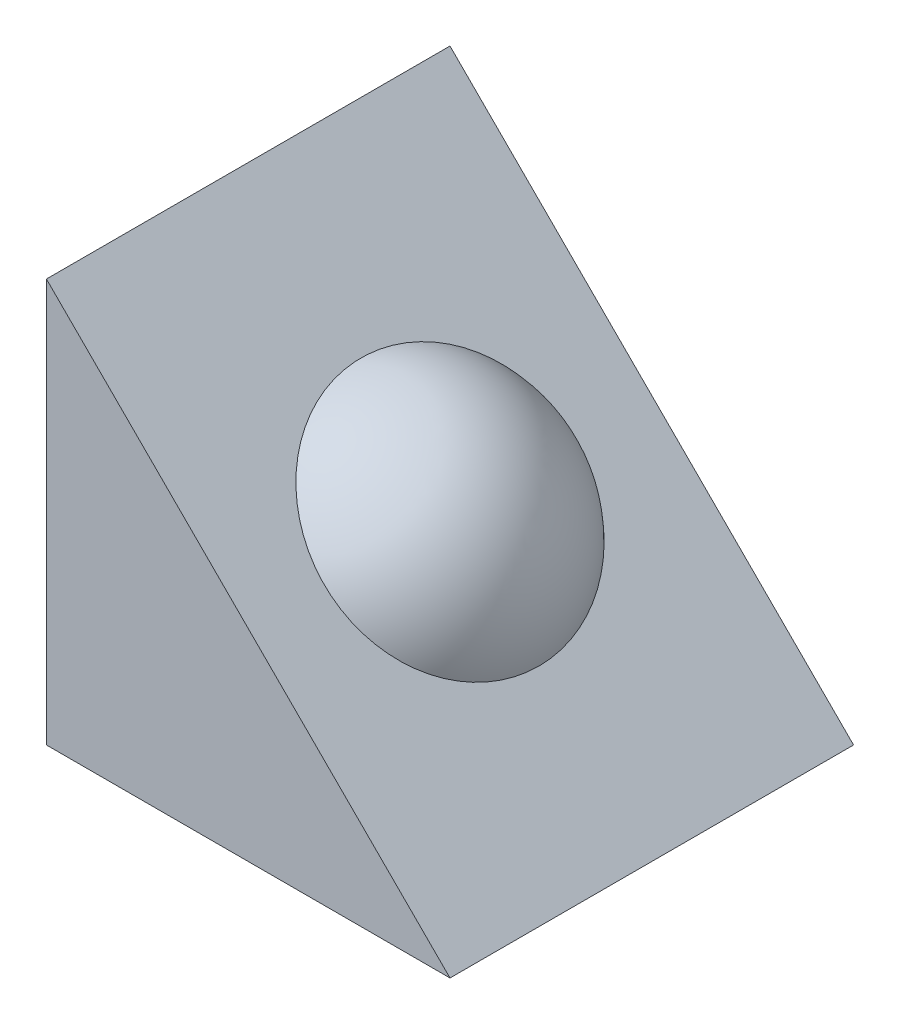
ISO-10303-21;
HEADER;
FILE_DESCRIPTION(('STEP AP214'),'2;1');
FILE_NAME('part.step','',(''),(''),'','','');
FILE_SCHEMA(('AUTOMOTIVE_DESIGN { 1 0 10303 214 1 1 1 1 }'));
ENDSEC;
DATA;
#1=APPLICATION_CONTEXT('core data for automotive mechanical design processes');
#2=APPLICATION_PROTOCOL_DEFINITION('international standard','automotive_design',2000,#1);
#3=PRODUCT_CONTEXT('',#1,'mechanical');
#4=PRODUCT('Part','Part','',(#3));
#5=PRODUCT_RELATED_PRODUCT_CATEGORY('part','',(#4));
#6=PRODUCT_DEFINITION_FORMATION('','',#4);
#7=PRODUCT_DEFINITION_CONTEXT('part definition',#1,'design');
#8=PRODUCT_DEFINITION('design','',#6,#7);
#9=PRODUCT_DEFINITION_SHAPE('','',#8);
#10=(LENGTH_UNIT() NAMED_UNIT(*) SI_UNIT(.MILLI.,.METRE.));
#11=(NAMED_UNIT(*) PLANE_ANGLE_UNIT() SI_UNIT($,.RADIAN.));
#12=(NAMED_UNIT(*) SI_UNIT($,.STERADIAN.) SOLID_ANGLE_UNIT());
#13=UNCERTAINTY_MEASURE_WITH_UNIT(LENGTH_MEASURE(1.E-05),#10,'distance_accuracy_value','');
#14=(GEOMETRIC_REPRESENTATION_CONTEXT(3) GLOBAL_UNCERTAINTY_ASSIGNED_CONTEXT((#13)) GLOBAL_UNIT_ASSIGNED_CONTEXT((#10,
#11,#12)) REPRESENTATION_CONTEXT('',''));
#15=CARTESIAN_POINT('',(0.,0.,0.));
#16=DIRECTION('',(0.,0.,1.));
#17=DIRECTION('',(1.,0.,0.));
#18=AXIS2_PLACEMENT_3D('',#15,#16,#17);
#19=CARTESIAN_POINT('',(0.,0.,25.));
#20=DIRECTION('',(0.,1.,0.));
#21=DIRECTION('',(0.,0.,1.));
#22=AXIS2_PLACEMENT_3D('',#19,#20,#21);
#23=PLANE('',#22);
#24=DIRECTION('',(1.,0.,0.));
#25=VECTOR('',#24,1.);
#26=CARTESIAN_POINT('',(0.,0.,-25.));
#27=LINE('',#26,#25);
#28=CARTESIAN_POINT('',(0.,0.,-25.));
#29=VERTEX_POINT('',#28);
#30=CARTESIAN_POINT('',(50.,0.,-25.));
#31=VERTEX_POINT('',#30);
#32=EDGE_CURVE('E84',#29,#31,#27,.T.);
#33=ORIENTED_EDGE('',*,*,#32,.T.);
#34=DIRECTION('',(0.,0.,-1.));
#35=VECTOR('',#34,1.);
#36=CARTESIAN_POINT('',(50.,0.,25.));
#37=LINE('',#36,#35);
#38=CARTESIAN_POINT('',(50.,0.,25.));
#39=VERTEX_POINT('',#38);
#40=EDGE_CURVE('E43',#39,#31,#37,.T.);
#41=ORIENTED_EDGE('',*,*,#40,.F.);
#42=DIRECTION('',(1.,0.,0.));
#43=VECTOR('',#42,1.);
#44=CARTESIAN_POINT('',(0.,0.,25.));
#45=LINE('',#44,#43);
#46=CARTESIAN_POINT('',(0.,0.,25.));
#47=VERTEX_POINT('',#46);
#48=EDGE_CURVE('E77',#47,#39,#45,.T.);
#49=ORIENTED_EDGE('',*,*,#48,.F.);
#50=DIRECTION('',(0.,0.,-1.));
#51=VECTOR('',#50,1.);
#52=CARTESIAN_POINT('',(0.,0.,25.));
#53=LINE('',#52,#51);
#54=EDGE_CURVE('E85',#47,#29,#53,.T.);
#55=ORIENTED_EDGE('',*,*,#54,.T.);
#56=EDGE_LOOP('',(#33,#41,#49,#55));
#57=FACE_BOUND('',#56,.T.);
#58=ADVANCED_FACE('F35',(#57),#23,.F.);
#59=CARTESIAN_POINT('',(0.,50.,25.));
#60=DIRECTION('',(-0.707106781186547,-0.707106781186547,0.));
#61=DIRECTION('',(0.707106781186548,-0.707106781186548,0.));
#62=AXIS2_PLACEMENT_3D('',#59,#60,#61);
#63=PLANE('',#62);
#64=CARTESIAN_POINT('',(25.,25.,0.));
#65=DIRECTION('',(-0.707106781186547,-0.707106781186547,0.));
#66=DIRECTION('',(0.707106781186548,-0.707106781186548,0.));
#67=AXIS2_PLACEMENT_3D('',#64,#65,#66);
#68=CIRCLE('',#67,15.5884572681199);
#69=CARTESIAN_POINT('',(36.0227038425243,13.9772961574757,0.));
#70=VERTEX_POINT('',#69);
#71=EDGE_CURVE('E11',#70,#70,#68,.F.);
#72=ORIENTED_EDGE('',*,*,#71,.F.);
#73=EDGE_LOOP('',(#72));
#74=FACE_BOUND('',#73,.T.);
#75=DIRECTION('',(-0.707106781186547,0.707106781186547,0.));
#76=VECTOR('',#75,1.);
#77=CARTESIAN_POINT('',(0.,50.,-25.));
#78=LINE('',#77,#76);
#79=CARTESIAN_POINT('',(0.,50.,-25.));
#80=VERTEX_POINT('',#79);
#81=EDGE_CURVE('E64',#31,#80,#78,.T.);
#82=ORIENTED_EDGE('',*,*,#81,.T.);
#83=DIRECTION('',(0.,0.,-1.));
#84=VECTOR('',#83,1.);
#85=CARTESIAN_POINT('',(0.,50.,25.));
#86=LINE('',#85,#84);
#87=CARTESIAN_POINT('',(0.,50.,25.));
#88=VERTEX_POINT('',#87);
#89=EDGE_CURVE('E76',#88,#80,#86,.T.);
#90=ORIENTED_EDGE('',*,*,#89,.F.);
#91=DIRECTION('',(-0.707106781186547,0.707106781186547,0.));
#92=VECTOR('',#91,1.);
#93=CARTESIAN_POINT('',(0.,50.,25.));
#94=LINE('',#93,#92);
#95=EDGE_CURVE('E72',#39,#88,#94,.T.);
#96=ORIENTED_EDGE('',*,*,#95,.F.);
#97=ORIENTED_EDGE('',*,*,#40,.T.);
#98=EDGE_LOOP('',(#82,#90,#96,#97));
#99=FACE_BOUND('',#98,.T.);
#100=ADVANCED_FACE('F73',(#74,#99),#63,.F.);
#101=CARTESIAN_POINT('',(0.,0.,25.));
#102=DIRECTION('',(1.,0.,0.));
#103=DIRECTION('',(0.,0.,-1.));
#104=AXIS2_PLACEMENT_3D('',#101,#102,#103);
#105=PLANE('',#104);
#106=DIRECTION('',(0.,-1.,0.));
#107=VECTOR('',#106,1.);
#108=CARTESIAN_POINT('',(0.,0.,-25.));
#109=LINE('',#108,#107);
#110=EDGE_CURVE('E69',#80,#29,#109,.T.);
#111=ORIENTED_EDGE('',*,*,#110,.T.);
#112=ORIENTED_EDGE('',*,*,#54,.F.);
#113=DIRECTION('',(0.,-1.,0.));
#114=VECTOR('',#113,1.);
#115=CARTESIAN_POINT('',(0.,0.,25.));
#116=LINE('',#115,#114);
#117=EDGE_CURVE('E51',#88,#47,#116,.T.);
#118=ORIENTED_EDGE('',*,*,#117,.F.);
#119=ORIENTED_EDGE('',*,*,#89,.T.);
#120=EDGE_LOOP('',(#111,#112,#118,#119));
#121=FACE_BOUND('',#120,.T.);
#122=ADVANCED_FACE('F103',(#121),#105,.F.);
#123=CARTESIAN_POINT('',(0.,0.,25.));
#124=DIRECTION('',(0.,0.,1.));
#125=DIRECTION('',(1.,0.,0.));
#126=AXIS2_PLACEMENT_3D('',#123,#124,#125);
#127=PLANE('',#126);
#128=ORIENTED_EDGE('',*,*,#48,.T.);
#129=ORIENTED_EDGE('',*,*,#95,.T.);
#130=ORIENTED_EDGE('',*,*,#117,.T.);
#131=EDGE_LOOP('',(#128,#129,#130));
#132=FACE_BOUND('',#131,.T.);
#133=ADVANCED_FACE('F80',(#132),#127,.T.);
#134=CARTESIAN_POINT('',(0.,0.,-25.));
#135=DIRECTION('',(0.,0.,1.));
#136=DIRECTION('',(1.,0.,0.));
#137=AXIS2_PLACEMENT_3D('',#134,#135,#136);
#138=PLANE('',#137);
#139=ORIENTED_EDGE('',*,*,#32,.F.);
#140=ORIENTED_EDGE('',*,*,#110,.F.);
#141=ORIENTED_EDGE('',*,*,#81,.F.);
#142=EDGE_LOOP('',(#139,#140,#141));
#143=FACE_BOUND('',#142,.T.);
#144=ADVANCED_FACE('F93',(#143),#138,.F.);
#145=CARTESIAN_POINT('',(18.6360389693211,18.6360389693211,0.));
#146=DIRECTION('',(-0.707106781186548,0.707106781186547,0.));
#147=DIRECTION('',(0.707106781186547,0.707106781186548,0.));
#148=AXIS2_PLACEMENT_3D('',#145,#146,#147);
#149=SPHERICAL_SURFACE('',#148,18.);
#150=CARTESIAN_POINT('',(18.6360389693211,18.6360389693211,0.));
#151=DIRECTION('',(-0.707106781186548,-0.707106781186548,0.));
#152=DIRECTION('',(0.707106781186548,-0.707106781186548,0.));
#153=AXIS2_PLACEMENT_3D('',#150,#151,#152);
#154=SPHERICAL_SURFACE('',#153,18.);
#155=ORIENTED_EDGE('',*,*,#71,.T.);
#156=EDGE_LOOP('',(#155));
#157=FACE_BOUND('',#156,.T.);
#158=ADVANCED_FACE('F95',(#157),#154,.T.);
#159=CLOSED_SHELL('',(#58,#100,#122,#133,#144,#158));
#160=MANIFOLD_SOLID_BREP('B2',#159);
#161=ADVANCED_BREP_SHAPE_REPRESENTATION('',(#18,#160),#14);
#162=SHAPE_DEFINITION_REPRESENTATION(#9,#161);
ENDSEC;
END-ISO-10303-21;
